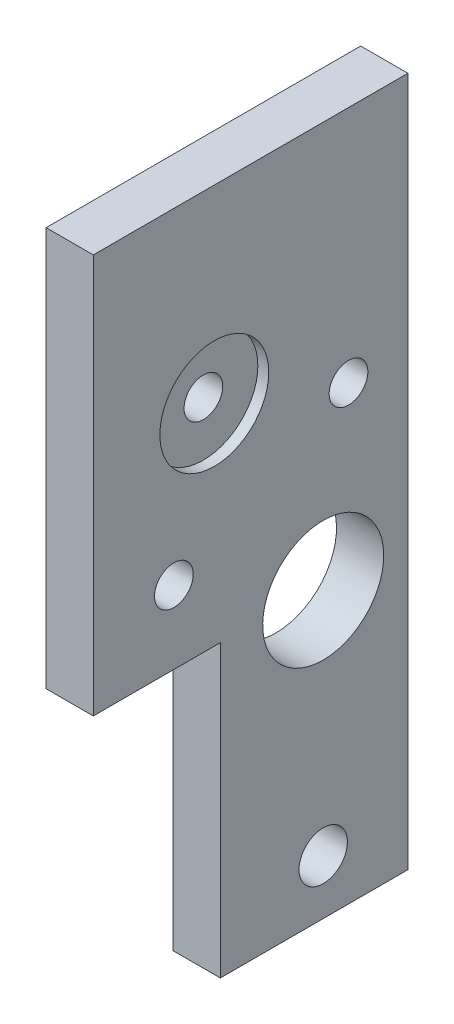
ISO-10303-21;
HEADER;
FILE_DESCRIPTION(('STEP AP214'),'2;1');
FILE_NAME('part.step','',(''),(''),'','','');
FILE_SCHEMA(('AUTOMOTIVE_DESIGN { 1 0 10303 214 1 1 1 1 }'));
ENDSEC;
DATA;
#1=APPLICATION_CONTEXT('core data for automotive mechanical design processes');
#2=APPLICATION_PROTOCOL_DEFINITION('international standard','automotive_design',2000,#1);
#3=PRODUCT_CONTEXT('',#1,'mechanical');
#4=PRODUCT('Part','Part','',(#3));
#5=PRODUCT_RELATED_PRODUCT_CATEGORY('part','',(#4));
#6=PRODUCT_DEFINITION_FORMATION('','',#4);
#7=PRODUCT_DEFINITION_CONTEXT('part definition',#1,'design');
#8=PRODUCT_DEFINITION('design','',#6,#7);
#9=PRODUCT_DEFINITION_SHAPE('','',#8);
#10=(LENGTH_UNIT() NAMED_UNIT(*) SI_UNIT(.MILLI.,.METRE.));
#11=(NAMED_UNIT(*) PLANE_ANGLE_UNIT() SI_UNIT($,.RADIAN.));
#12=(NAMED_UNIT(*) SI_UNIT($,.STERADIAN.) SOLID_ANGLE_UNIT());
#13=UNCERTAINTY_MEASURE_WITH_UNIT(LENGTH_MEASURE(1.E-05),#10,'distance_accuracy_value','');
#14=(GEOMETRIC_REPRESENTATION_CONTEXT(3) GLOBAL_UNCERTAINTY_ASSIGNED_CONTEXT((#13)) GLOBAL_UNIT_ASSIGNED_CONTEXT((#10,
#11,#12)) REPRESENTATION_CONTEXT('',''));
#15=CARTESIAN_POINT('',(0.,0.,0.));
#16=DIRECTION('',(0.,0.,1.));
#17=DIRECTION('',(1.,0.,0.));
#18=AXIS2_PLACEMENT_3D('',#15,#16,#17);
#19=CARTESIAN_POINT('',(-4.,0.,0.));
#20=DIRECTION('',(0.,-1.,0.));
#21=DIRECTION('',(0.,0.,-1.));
#22=AXIS2_PLACEMENT_3D('',#19,#20,#21);
#23=PLANE('',#22);
#24=DIRECTION('',(0.,0.,-1.));
#25=VECTOR('',#24,1.);
#26=CARTESIAN_POINT('',(3.89999999999999,0.,26.));
#27=LINE('',#26,#25);
#28=CARTESIAN_POINT('',(3.89999999999999,0.,15.5));
#29=VERTEX_POINT('',#28);
#30=CARTESIAN_POINT('',(3.89999999999999,0.,0.));
#31=VERTEX_POINT('',#30);
#32=EDGE_CURVE('E85',#29,#31,#27,.T.);
#33=ORIENTED_EDGE('',*,*,#32,.F.);
#34=DIRECTION('',(1.,0.,0.));
#35=VECTOR('',#34,1.);
#36=CARTESIAN_POINT('',(-4.,0.,15.5));
#37=LINE('',#36,#35);
#38=CARTESIAN_POINT('',(0.,0.,15.5));
#39=VERTEX_POINT('',#38);
#40=EDGE_CURVE('E111',#39,#29,#37,.T.);
#41=ORIENTED_EDGE('',*,*,#40,.F.);
#42=DIRECTION('',(0.,0.,-1.));
#43=VECTOR('',#42,1.);
#44=CARTESIAN_POINT('',(0.,0.,0.));
#45=LINE('',#44,#43);
#46=CARTESIAN_POINT('',(0.,0.,0.));
#47=VERTEX_POINT('',#46);
#48=EDGE_CURVE('E106',#39,#47,#45,.T.);
#49=ORIENTED_EDGE('',*,*,#48,.T.);
#50=DIRECTION('',(1.,0.,0.));
#51=VECTOR('',#50,1.);
#52=CARTESIAN_POINT('',(-4.,0.,0.));
#53=LINE('',#52,#51);
#54=EDGE_CURVE('E101',#47,#31,#53,.T.);
#55=ORIENTED_EDGE('',*,*,#54,.T.);
#56=EDGE_LOOP('',(#33,#41,#49,#55));
#57=FACE_BOUND('',#56,.T.);
#58=ADVANCED_FACE('F35',(#57),#23,.T.);
#59=CARTESIAN_POINT('',(-4.,0.,0.));
#60=DIRECTION('',(0.,0.,-1.));
#61=DIRECTION('',(0.,1.,0.));
#62=AXIS2_PLACEMENT_3D('',#59,#60,#61);
#63=PLANE('',#62);
#64=DIRECTION('',(0.,1.,0.));
#65=VECTOR('',#64,1.);
#66=CARTESIAN_POINT('',(3.9,57.,0.));
#67=LINE('',#66,#65);
#68=CARTESIAN_POINT('',(3.9,57.,0.));
#69=VERTEX_POINT('',#68);
#70=EDGE_CURVE('E89',#31,#69,#67,.T.);
#71=ORIENTED_EDGE('',*,*,#70,.F.);
#72=ORIENTED_EDGE('',*,*,#54,.F.);
#73=DIRECTION('',(0.,1.,0.));
#74=VECTOR('',#73,1.);
#75=CARTESIAN_POINT('',(0.,0.,0.));
#76=LINE('',#75,#74);
#77=CARTESIAN_POINT('',(0.,57.,0.));
#78=VERTEX_POINT('',#77);
#79=EDGE_CURVE('E118',#47,#78,#76,.T.);
#80=ORIENTED_EDGE('',*,*,#79,.T.);
#81=DIRECTION('',(1.,0.,0.));
#82=VECTOR('',#81,1.);
#83=CARTESIAN_POINT('',(-4.,57.,0.));
#84=LINE('',#83,#82);
#85=EDGE_CURVE('E103',#78,#69,#84,.T.);
#86=ORIENTED_EDGE('',*,*,#85,.T.);
#87=EDGE_LOOP('',(#71,#72,#80,#86));
#88=FACE_BOUND('',#87,.T.);
#89=ADVANCED_FACE('F37',(#88),#63,.T.);
#90=CARTESIAN_POINT('',(-4.,57.,0.));
#91=DIRECTION('',(0.,1.,0.));
#92=DIRECTION('',(0.,0.,1.));
#93=AXIS2_PLACEMENT_3D('',#90,#91,#92);
#94=PLANE('',#93);
#95=DIRECTION('',(0.,0.,-1.));
#96=VECTOR('',#95,1.);
#97=CARTESIAN_POINT('',(3.9,57.,26.));
#98=LINE('',#97,#96);
#99=CARTESIAN_POINT('',(3.9,57.,26.));
#100=VERTEX_POINT('',#99);
#101=EDGE_CURVE('E50',#100,#69,#98,.T.);
#102=ORIENTED_EDGE('',*,*,#101,.T.);
#103=ORIENTED_EDGE('',*,*,#85,.F.);
#104=DIRECTION('',(0.,0.,1.));
#105=VECTOR('',#104,1.);
#106=CARTESIAN_POINT('',(0.,57.,0.));
#107=LINE('',#106,#105);
#108=CARTESIAN_POINT('',(0.,57.,26.));
#109=VERTEX_POINT('',#108);
#110=EDGE_CURVE('E120',#78,#109,#107,.T.);
#111=ORIENTED_EDGE('',*,*,#110,.T.);
#112=DIRECTION('',(1.,0.,0.));
#113=VECTOR('',#112,1.);
#114=CARTESIAN_POINT('',(0.,57.,26.));
#115=LINE('',#114,#113);
#116=EDGE_CURVE('E56',#109,#100,#115,.T.);
#117=ORIENTED_EDGE('',*,*,#116,.T.);
#118=EDGE_LOOP('',(#102,#103,#111,#117));
#119=FACE_BOUND('',#118,.T.);
#120=ADVANCED_FACE('F177',(#119),#94,.T.);
#121=CARTESIAN_POINT('',(-4.,23.5,7.));
#122=DIRECTION('',(1.,0.,0.));
#123=DIRECTION('',(0.,0.,-1.));
#124=AXIS2_PLACEMENT_3D('',#121,#122,#123);
#125=CYLINDRICAL_SURFACE('',#124,5.);
#126=CARTESIAN_POINT('',(3.9,23.5,7.));
#127=DIRECTION('',(-1.,0.,0.));
#128=DIRECTION('',(0.,-1.,0.));
#129=AXIS2_PLACEMENT_3D('',#126,#127,#128);
#130=CIRCLE('',#129,5.);
#131=CARTESIAN_POINT('',(3.9,18.5,7.));
#132=VERTEX_POINT('',#131);
#133=EDGE_CURVE('E157',#132,#132,#130,.F.);
#134=ORIENTED_EDGE('',*,*,#133,.T.);
#135=EDGE_LOOP('',(#134));
#136=FACE_BOUND('',#135,.T.);
#137=CARTESIAN_POINT('',(0.,23.5,7.));
#138=DIRECTION('',(-1.,0.,0.));
#139=DIRECTION('',(0.,0.,1.));
#140=AXIS2_PLACEMENT_3D('',#137,#138,#139);
#141=CIRCLE('',#140,5.);
#142=CARTESIAN_POINT('',(0.,23.5,12.));
#143=VERTEX_POINT('',#142);
#144=EDGE_CURVE('E113',#143,#143,#141,.F.);
#145=ORIENTED_EDGE('',*,*,#144,.F.);
#146=EDGE_LOOP('',(#145));
#147=FACE_BOUND('',#146,.T.);
#148=ADVANCED_FACE('F198',(#136,#147),#125,.F.);
#149=CARTESIAN_POINT('',(-4.,24.,30.));
#150=DIRECTION('',(0.,1.,0.));
#151=DIRECTION('',(0.,0.,1.));
#152=AXIS2_PLACEMENT_3D('',#149,#150,#151);
#153=PLANE('',#152);
#154=DIRECTION('',(1.,0.,0.));
#155=VECTOR('',#154,1.);
#156=CARTESIAN_POINT('',(-4.,24.,15.5));
#157=LINE('',#156,#155);
#158=CARTESIAN_POINT('',(0.,24.,15.5));
#159=VERTEX_POINT('',#158);
#160=CARTESIAN_POINT('',(3.9,24.,15.5));
#161=VERTEX_POINT('',#160);
#162=EDGE_CURVE('E108',#159,#161,#157,.T.);
#163=ORIENTED_EDGE('',*,*,#162,.T.);
#164=DIRECTION('',(0.,0.,1.));
#165=VECTOR('',#164,1.);
#166=CARTESIAN_POINT('',(3.9,24.,30.));
#167=LINE('',#166,#165);
#168=CARTESIAN_POINT('',(3.9,24.,26.));
#169=VERTEX_POINT('',#168);
#170=EDGE_CURVE('E160',#161,#169,#167,.T.);
#171=ORIENTED_EDGE('',*,*,#170,.T.);
#172=DIRECTION('',(1.,0.,0.));
#173=VECTOR('',#172,1.);
#174=CARTESIAN_POINT('',(0.,24.,26.));
#175=LINE('',#174,#173);
#176=CARTESIAN_POINT('',(0.,24.,26.));
#177=VERTEX_POINT('',#176);
#178=EDGE_CURVE('E151',#177,#169,#175,.T.);
#179=ORIENTED_EDGE('',*,*,#178,.F.);
#180=DIRECTION('',(0.,0.,1.));
#181=VECTOR('',#180,1.);
#182=CARTESIAN_POINT('',(0.,24.,30.));
#183=LINE('',#182,#181);
#184=EDGE_CURVE('E124',#159,#177,#183,.T.);
#185=ORIENTED_EDGE('',*,*,#184,.F.);
#186=EDGE_LOOP('',(#163,#171,#179,#185));
#187=FACE_BOUND('',#186,.T.);
#188=ADVANCED_FACE('F185',(#187),#153,.F.);
#189=CARTESIAN_POINT('',(-4.,0.,15.5));
#190=DIRECTION('',(0.,0.,-1.));
#191=DIRECTION('',(-1.,0.,0.));
#192=AXIS2_PLACEMENT_3D('',#189,#190,#191);
#193=PLANE('',#192);
#194=ORIENTED_EDGE('',*,*,#40,.T.);
#195=DIRECTION('',(0.,1.,0.));
#196=VECTOR('',#195,1.);
#197=CARTESIAN_POINT('',(3.89999999999999,0.,15.5));
#198=LINE('',#197,#196);
#199=EDGE_CURVE('E91',#29,#161,#198,.T.);
#200=ORIENTED_EDGE('',*,*,#199,.T.);
#201=ORIENTED_EDGE('',*,*,#162,.F.);
#202=DIRECTION('',(0.,1.,0.));
#203=VECTOR('',#202,1.);
#204=CARTESIAN_POINT('',(0.,0.,15.5));
#205=LINE('',#204,#203);
#206=EDGE_CURVE('E43',#39,#159,#205,.T.);
#207=ORIENTED_EDGE('',*,*,#206,.F.);
#208=EDGE_LOOP('',(#194,#200,#201,#207));
#209=FACE_BOUND('',#208,.T.);
#210=ADVANCED_FACE('F188',(#209),#193,.F.);
#211=CARTESIAN_POINT('',(0.,0.,0.));
#212=DIRECTION('',(-1.,0.,0.));
#213=DIRECTION('',(0.,0.,-1.));
#214=AXIS2_PLACEMENT_3D('',#211,#212,#213);
#215=PLANE('',#214);
#216=DIRECTION('',(0.,1.,0.));
#217=VECTOR('',#216,1.);
#218=CARTESIAN_POINT('',(0.,57.,26.));
#219=LINE('',#218,#217);
#220=EDGE_CURVE('E154',#177,#109,#219,.T.);
#221=ORIENTED_EDGE('',*,*,#220,.T.);
#222=ORIENTED_EDGE('',*,*,#110,.F.);
#223=ORIENTED_EDGE('',*,*,#79,.F.);
#224=ORIENTED_EDGE('',*,*,#48,.F.);
#225=ORIENTED_EDGE('',*,*,#206,.T.);
#226=ORIENTED_EDGE('',*,*,#184,.T.);
#227=EDGE_LOOP('',(#221,#222,#223,#224,#225,#226));
#228=FACE_BOUND('',#227,.T.);
#229=CARTESIAN_POINT('',(0.,30.0326086873371,19.3396657899873));
#230=DIRECTION('',(-1.,0.,0.));
#231=DIRECTION('',(0.,0.,1.));
#232=AXIS2_PLACEMENT_3D('',#229,#230,#231);
#233=CIRCLE('',#232,2.);
#234=CARTESIAN_POINT('',(0.,30.0326086873371,21.3396657899873));
#235=VERTEX_POINT('',#234);
#236=EDGE_CURVE('E148',#235,#235,#233,.T.);
#237=ORIENTED_EDGE('',*,*,#236,.F.);
#238=EDGE_LOOP('',(#237));
#239=FACE_BOUND('',#238,.T.);
#240=CARTESIAN_POINT('',(0.,37.3046086873371,4.90832434159796));
#241=DIRECTION('',(-1.,0.,0.));
#242=DIRECTION('',(0.,0.,1.));
#243=AXIS2_PLACEMENT_3D('',#240,#241,#242);
#244=CIRCLE('',#243,2.);
#245=CARTESIAN_POINT('',(0.,37.3046086873371,6.90832434159796));
#246=VERTEX_POINT('',#245);
#247=EDGE_CURVE('E142',#246,#246,#244,.T.);
#248=ORIENTED_EDGE('',*,*,#247,.F.);
#249=EDGE_LOOP('',(#248));
#250=FACE_BOUND('',#249,.T.);
#251=CARTESIAN_POINT('',(0.,41.3605710994918,16.));
#252=DIRECTION('',(1.,0.,0.));
#253=DIRECTION('',(0.,0.,-1.));
#254=AXIS2_PLACEMENT_3D('',#251,#252,#253);
#255=CIRCLE('',#254,1.6);
#256=CARTESIAN_POINT('',(0.,41.3605710994918,14.4));
#257=VERTEX_POINT('',#256);
#258=EDGE_CURVE('E130',#257,#257,#255,.T.);
#259=ORIENTED_EDGE('',*,*,#258,.T.);
#260=EDGE_LOOP('',(#259));
#261=FACE_BOUND('',#260,.T.);
#262=CARTESIAN_POINT('',(0.,4.5,7.));
#263=DIRECTION('',(-1.,0.,0.));
#264=DIRECTION('',(0.,0.,1.));
#265=AXIS2_PLACEMENT_3D('',#262,#263,#264);
#266=CIRCLE('',#265,1.99999999999999);
#267=CARTESIAN_POINT('',(0.,4.5,8.99999999999999));
#268=VERTEX_POINT('',#267);
#269=EDGE_CURVE('E127',#268,#268,#266,.T.);
#270=ORIENTED_EDGE('',*,*,#269,.F.);
#271=EDGE_LOOP('',(#270));
#272=FACE_BOUND('',#271,.T.);
#273=ORIENTED_EDGE('',*,*,#144,.T.);
#274=EDGE_LOOP('',(#273));
#275=FACE_BOUND('',#274,.T.);
#276=ADVANCED_FACE('F179',(#228,#239,#250,#261,#272,#275),#215,.T.);
#277=CARTESIAN_POINT('',(0.,4.5,7.));
#278=DIRECTION('',(-1.,0.,0.));
#279=DIRECTION('',(0.,0.,1.));
#280=AXIS2_PLACEMENT_3D('',#277,#278,#279);
#281=CYLINDRICAL_SURFACE('',#280,1.99999999999999);
#282=CARTESIAN_POINT('',(3.89999999999999,4.5,7.));
#283=DIRECTION('',(-1.,0.,0.));
#284=DIRECTION('',(0.,-1.,0.));
#285=AXIS2_PLACEMENT_3D('',#282,#283,#284);
#286=CIRCLE('',#285,1.99999999999999);
#287=CARTESIAN_POINT('',(3.89999999999999,2.50000000000001,7.));
#288=VERTEX_POINT('',#287);
#289=EDGE_CURVE('E164',#288,#288,#286,.F.);
#290=ORIENTED_EDGE('',*,*,#289,.T.);
#291=EDGE_LOOP('',(#290));
#292=FACE_BOUND('',#291,.T.);
#293=ORIENTED_EDGE('',*,*,#269,.T.);
#294=EDGE_LOOP('',(#293));
#295=FACE_BOUND('',#294,.T.);
#296=ADVANCED_FACE('F196',(#292,#295),#281,.F.);
#297=CARTESIAN_POINT('',(4.,41.3605710994918,16.));
#298=DIRECTION('',(1.,0.,0.));
#299=DIRECTION('',(0.,0.,-1.));
#300=AXIS2_PLACEMENT_3D('',#297,#298,#299);
#301=CYLINDRICAL_SURFACE('',#300,1.6);
#302=ORIENTED_EDGE('',*,*,#258,.F.);
#303=EDGE_LOOP('',(#302));
#304=FACE_BOUND('',#303,.T.);
#305=CARTESIAN_POINT('',(3.,41.3605710994918,16.));
#306=DIRECTION('',(1.,0.,0.));
#307=DIRECTION('',(0.,0.,-1.));
#308=AXIS2_PLACEMENT_3D('',#305,#306,#307);
#309=CIRCLE('',#308,1.60000000000001);
#310=CARTESIAN_POINT('',(3.,41.3605710994918,14.4));
#311=VERTEX_POINT('',#310);
#312=EDGE_CURVE('E133',#311,#311,#309,.T.);
#313=ORIENTED_EDGE('',*,*,#312,.T.);
#314=EDGE_LOOP('',(#313));
#315=FACE_BOUND('',#314,.T.);
#316=ADVANCED_FACE('F248',(#304,#315),#301,.F.);
#317=CARTESIAN_POINT('',(3.,42.9605710994918,16.));
#318=DIRECTION('',(-1.,0.,0.));
#319=DIRECTION('',(0.,0.,1.));
#320=AXIS2_PLACEMENT_3D('',#317,#318,#319);
#321=PLANE('',#320);
#322=ORIENTED_EDGE('',*,*,#312,.F.);
#323=EDGE_LOOP('',(#322));
#324=FACE_BOUND('',#323,.T.);
#325=CARTESIAN_POINT('',(3.,41.3605710994918,16.));
#326=DIRECTION('',(1.,0.,0.));
#327=DIRECTION('',(0.,0.,-1.));
#328=AXIS2_PLACEMENT_3D('',#325,#326,#327);
#329=CIRCLE('',#328,4.5);
#330=CARTESIAN_POINT('',(3.,41.3605710994918,11.5));
#331=VERTEX_POINT('',#330);
#332=EDGE_CURVE('E136',#331,#331,#329,.T.);
#333=ORIENTED_EDGE('',*,*,#332,.T.);
#334=EDGE_LOOP('',(#333));
#335=FACE_BOUND('',#334,.T.);
#336=ADVANCED_FACE('F244',(#324,#335),#321,.F.);
#337=CARTESIAN_POINT('',(4.,41.3605710994918,16.));
#338=DIRECTION('',(1.,0.,0.));
#339=DIRECTION('',(0.,0.,-1.));
#340=AXIS2_PLACEMENT_3D('',#337,#338,#339);
#341=CYLINDRICAL_SURFACE('',#340,4.5);
#342=CARTESIAN_POINT('',(3.9,41.3605710994918,16.));
#343=DIRECTION('',(-1.,0.,0.));
#344=DIRECTION('',(0.,-1.,0.));
#345=AXIS2_PLACEMENT_3D('',#342,#343,#344);
#346=CIRCLE('',#345,4.5);
#347=CARTESIAN_POINT('',(3.9,36.8605710994917,16.));
#348=VERTEX_POINT('',#347);
#349=EDGE_CURVE('E167',#348,#348,#346,.F.);
#350=ORIENTED_EDGE('',*,*,#349,.T.);
#351=EDGE_LOOP('',(#350));
#352=FACE_BOUND('',#351,.T.);
#353=ORIENTED_EDGE('',*,*,#332,.F.);
#354=EDGE_LOOP('',(#353));
#355=FACE_BOUND('',#354,.T.);
#356=ADVANCED_FACE('F240',(#352,#355),#341,.F.);
#357=CARTESIAN_POINT('',(0.,37.3046086873371,4.90832434159796));
#358=DIRECTION('',(-1.,0.,0.));
#359=DIRECTION('',(0.,0.,1.));
#360=AXIS2_PLACEMENT_3D('',#357,#358,#359);
#361=CYLINDRICAL_SURFACE('',#360,1.59999999999999);
#362=CARTESIAN_POINT('',(3.9,37.3046086873371,4.90832434159796));
#363=DIRECTION('',(-1.,0.,0.));
#364=DIRECTION('',(0.,-1.,0.));
#365=AXIS2_PLACEMENT_3D('',#362,#363,#364);
#366=CIRCLE('',#365,1.59999999999999);
#367=CARTESIAN_POINT('',(3.9,35.7046086873371,4.90832434159796));
#368=VERTEX_POINT('',#367);
#369=EDGE_CURVE('E170',#368,#368,#366,.F.);
#370=ORIENTED_EDGE('',*,*,#369,.T.);
#371=EDGE_LOOP('',(#370));
#372=FACE_BOUND('',#371,.T.);
#373=CARTESIAN_POINT('',(0.399999999999998,37.3046086873371,4.90832434159796));
#374=DIRECTION('',(-1.,0.,0.));
#375=DIRECTION('',(0.,0.,1.));
#376=AXIS2_PLACEMENT_3D('',#373,#374,#375);
#377=CIRCLE('',#376,1.59999999999999);
#378=CARTESIAN_POINT('',(0.399999999999998,37.3046086873371,6.50832434159795));
#379=VERTEX_POINT('',#378);
#380=EDGE_CURVE('E139',#379,#379,#377,.T.);
#381=ORIENTED_EDGE('',*,*,#380,.T.);
#382=EDGE_LOOP('',(#381));
#383=FACE_BOUND('',#382,.T.);
#384=ADVANCED_FACE('F236',(#372,#383),#361,.F.);
#385=CARTESIAN_POINT('',(0.,37.3046086873371,4.90832434159796));
#386=DIRECTION('',(-1.,0.,0.));
#387=DIRECTION('',(0.,0.,1.));
#388=AXIS2_PLACEMENT_3D('',#385,#386,#387);
#389=CONICAL_SURFACE('',#388,2.,0.785398163397463);
#390=ORIENTED_EDGE('',*,*,#380,.F.);
#391=EDGE_LOOP('',(#390));
#392=FACE_BOUND('',#391,.T.);
#393=ORIENTED_EDGE('',*,*,#247,.T.);
#394=EDGE_LOOP('',(#393));
#395=FACE_BOUND('',#394,.T.);
#396=ADVANCED_FACE('F232',(#392,#395),#389,.F.);
#397=CARTESIAN_POINT('',(0.,30.0326086873371,19.3396657899873));
#398=DIRECTION('',(-1.,0.,0.));
#399=DIRECTION('',(0.,0.,1.));
#400=AXIS2_PLACEMENT_3D('',#397,#398,#399);
#401=CYLINDRICAL_SURFACE('',#400,1.59999999999999);
#402=CARTESIAN_POINT('',(3.9,30.0326086873371,19.3396657899873));
#403=DIRECTION('',(-1.,0.,0.));
#404=DIRECTION('',(0.,-1.,0.));
#405=AXIS2_PLACEMENT_3D('',#402,#403,#404);
#406=CIRCLE('',#405,1.59999999999999);
#407=CARTESIAN_POINT('',(3.9,28.4326086873371,19.3396657899873));
#408=VERTEX_POINT('',#407);
#409=EDGE_CURVE('E173',#408,#408,#406,.F.);
#410=ORIENTED_EDGE('',*,*,#409,.T.);
#411=EDGE_LOOP('',(#410));
#412=FACE_BOUND('',#411,.T.);
#413=CARTESIAN_POINT('',(0.399999999999998,30.0326086873371,19.3396657899873));
#414=DIRECTION('',(-1.,0.,0.));
#415=DIRECTION('',(0.,0.,1.));
#416=AXIS2_PLACEMENT_3D('',#413,#414,#415);
#417=CIRCLE('',#416,1.59999999999999);
#418=CARTESIAN_POINT('',(0.399999999999998,30.0326086873371,20.9396657899873));
#419=VERTEX_POINT('',#418);
#420=EDGE_CURVE('E145',#419,#419,#417,.T.);
#421=ORIENTED_EDGE('',*,*,#420,.T.);
#422=EDGE_LOOP('',(#421));
#423=FACE_BOUND('',#422,.T.);
#424=ADVANCED_FACE('F228',(#412,#423),#401,.F.);
#425=CARTESIAN_POINT('',(0.,30.0326086873371,19.3396657899873));
#426=DIRECTION('',(-1.,0.,0.));
#427=DIRECTION('',(0.,0.,1.));
#428=AXIS2_PLACEMENT_3D('',#425,#426,#427);
#429=CONICAL_SURFACE('',#428,2.,0.785398163397463);
#430=ORIENTED_EDGE('',*,*,#420,.F.);
#431=EDGE_LOOP('',(#430));
#432=FACE_BOUND('',#431,.T.);
#433=ORIENTED_EDGE('',*,*,#236,.T.);
#434=EDGE_LOOP('',(#433));
#435=FACE_BOUND('',#434,.T.);
#436=ADVANCED_FACE('F223',(#432,#435),#429,.F.);
#437=CARTESIAN_POINT('',(0.,57.,26.));
#438=DIRECTION('',(0.,0.,-1.));
#439=DIRECTION('',(0.,1.,0.));
#440=AXIS2_PLACEMENT_3D('',#437,#438,#439);
#441=PLANE('',#440);
#442=ORIENTED_EDGE('',*,*,#178,.T.);
#443=DIRECTION('',(0.,1.,0.));
#444=VECTOR('',#443,1.);
#445=CARTESIAN_POINT('',(3.9,57.,26.));
#446=LINE('',#445,#444);
#447=EDGE_CURVE('E11',#169,#100,#446,.T.);
#448=ORIENTED_EDGE('',*,*,#447,.T.);
#449=ORIENTED_EDGE('',*,*,#116,.F.);
#450=ORIENTED_EDGE('',*,*,#220,.F.);
#451=EDGE_LOOP('',(#442,#448,#449,#450));
#452=FACE_BOUND('',#451,.T.);
#453=ADVANCED_FACE('F183',(#452),#441,.F.);
#454=CARTESIAN_POINT('',(3.9,57.,26.));
#455=DIRECTION('',(-1.,0.,0.));
#456=DIRECTION('',(0.,-1.,0.));
#457=AXIS2_PLACEMENT_3D('',#454,#455,#456);
#458=PLANE('',#457);
#459=ORIENTED_EDGE('',*,*,#199,.F.);
#460=ORIENTED_EDGE('',*,*,#32,.T.);
#461=ORIENTED_EDGE('',*,*,#70,.T.);
#462=ORIENTED_EDGE('',*,*,#101,.F.);
#463=ORIENTED_EDGE('',*,*,#447,.F.);
#464=ORIENTED_EDGE('',*,*,#170,.F.);
#465=EDGE_LOOP('',(#459,#460,#461,#462,#463,#464));
#466=FACE_BOUND('',#465,.T.);
#467=ORIENTED_EDGE('',*,*,#289,.F.);
#468=EDGE_LOOP('',(#467));
#469=FACE_BOUND('',#468,.T.);
#470=ORIENTED_EDGE('',*,*,#369,.F.);
#471=EDGE_LOOP('',(#470));
#472=FACE_BOUND('',#471,.T.);
#473=ORIENTED_EDGE('',*,*,#409,.F.);
#474=EDGE_LOOP('',(#473));
#475=FACE_BOUND('',#474,.T.);
#476=ORIENTED_EDGE('',*,*,#349,.F.);
#477=EDGE_LOOP('',(#476));
#478=FACE_BOUND('',#477,.T.);
#479=ORIENTED_EDGE('',*,*,#133,.F.);
#480=EDGE_LOOP('',(#479));
#481=FACE_BOUND('',#480,.T.);
#482=ADVANCED_FACE('F87',(#466,#469,#472,#475,#478,#481),#458,.F.);
#483=CLOSED_SHELL('',(#58,#89,#120,#148,#188,#210,#276,#296,#316,#336,#356,#384,#396,#424,#436,
#453,#482));
#484=MANIFOLD_SOLID_BREP('B2',#483);
#485=ADVANCED_BREP_SHAPE_REPRESENTATION('',(#18,#484),#14);
#486=SHAPE_DEFINITION_REPRESENTATION(#9,#485);
ENDSEC;
END-ISO-10303-21;
